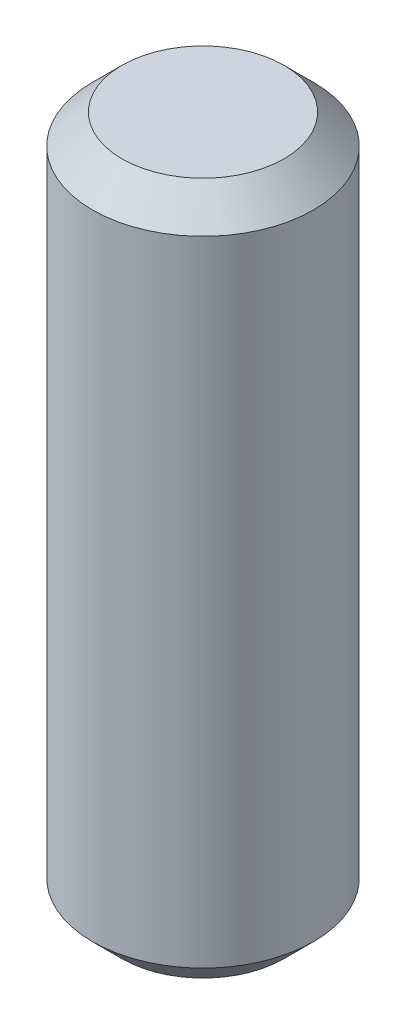
ISO-10303-21;
HEADER;
FILE_DESCRIPTION(('STEP AP214'),'2;1');
FILE_NAME('part.step','',(''),(''),'','','');
FILE_SCHEMA(('AUTOMOTIVE_DESIGN { 1 0 10303 214 1 1 1 1 }'));
ENDSEC;
DATA;
#1=APPLICATION_CONTEXT('core data for automotive mechanical design processes');
#2=APPLICATION_PROTOCOL_DEFINITION('international standard','automotive_design',2000,#1);
#3=PRODUCT_CONTEXT('',#1,'mechanical');
#4=PRODUCT('Part','Part','',(#3));
#5=PRODUCT_RELATED_PRODUCT_CATEGORY('part','',(#4));
#6=PRODUCT_DEFINITION_FORMATION('','',#4);
#7=PRODUCT_DEFINITION_CONTEXT('part definition',#1,'design');
#8=PRODUCT_DEFINITION('design','',#6,#7);
#9=PRODUCT_DEFINITION_SHAPE('','',#8);
#10=(LENGTH_UNIT() NAMED_UNIT(*) SI_UNIT(.MILLI.,.METRE.));
#11=(NAMED_UNIT(*) PLANE_ANGLE_UNIT() SI_UNIT($,.RADIAN.));
#12=(NAMED_UNIT(*) SI_UNIT($,.STERADIAN.) SOLID_ANGLE_UNIT());
#13=UNCERTAINTY_MEASURE_WITH_UNIT(LENGTH_MEASURE(1.E-05),#10,'distance_accuracy_value','');
#14=(GEOMETRIC_REPRESENTATION_CONTEXT(3) GLOBAL_UNCERTAINTY_ASSIGNED_CONTEXT((#13)) GLOBAL_UNIT_ASSIGNED_CONTEXT((#10,
#11,#12)) REPRESENTATION_CONTEXT('',''));
#15=CARTESIAN_POINT('',(0.,0.,0.));
#16=DIRECTION('',(0.,0.,1.));
#17=DIRECTION('',(1.,0.,0.));
#18=AXIS2_PLACEMENT_3D('',#15,#16,#17);
#19=CARTESIAN_POINT('',(0.,4.7,0.));
#20=DIRECTION('',(0.,-1.,0.));
#21=DIRECTION('',(0.,0.,-1.));
#22=AXIS2_PLACEMENT_3D('',#19,#20,#21);
#23=CYLINDRICAL_SURFACE('',#22,0.75);
#24=CARTESIAN_POINT('',(0.,0.2,0.));
#25=DIRECTION('',(0.,1.,0.));
#26=DIRECTION('',(0.,0.,1.));
#27=AXIS2_PLACEMENT_3D('',#24,#25,#26);
#28=CIRCLE('',#27,0.75);
#29=CARTESIAN_POINT('',(0.,0.2,0.75));
#30=VERTEX_POINT('',#29);
#31=EDGE_CURVE('E59',#30,#30,#28,.T.);
#32=ORIENTED_EDGE('',*,*,#31,.T.);
#33=EDGE_LOOP('',(#32));
#34=FACE_BOUND('',#33,.T.);
#35=CARTESIAN_POINT('',(0.,4.5,0.));
#36=DIRECTION('',(0.,1.,0.));
#37=DIRECTION('',(0.,0.,1.));
#38=AXIS2_PLACEMENT_3D('',#35,#36,#37);
#39=CIRCLE('',#38,0.75);
#40=CARTESIAN_POINT('',(0.,4.5,0.75));
#41=VERTEX_POINT('',#40);
#42=EDGE_CURVE('E64',#41,#41,#39,.F.);
#43=ORIENTED_EDGE('',*,*,#42,.T.);
#44=EDGE_LOOP('',(#43));
#45=FACE_BOUND('',#44,.T.);
#46=ADVANCED_FACE('F45',(#34,#45),#23,.T.);
#47=CARTESIAN_POINT('',(0.,4.7,0.));
#48=DIRECTION('',(0.,1.,0.));
#49=DIRECTION('',(0.,0.,1.));
#50=AXIS2_PLACEMENT_3D('',#47,#48,#49);
#51=PLANE('',#50);
#52=CARTESIAN_POINT('',(0.,4.7,0.));
#53=DIRECTION('',(0.,1.,0.));
#54=DIRECTION('',(0.,0.,1.));
#55=AXIS2_PLACEMENT_3D('',#52,#53,#54);
#56=CIRCLE('',#55,0.55);
#57=CARTESIAN_POINT('',(0.,4.7,0.55));
#58=VERTEX_POINT('',#57);
#59=EDGE_CURVE('E10',#58,#58,#56,.T.);
#60=ORIENTED_EDGE('',*,*,#59,.T.);
#61=EDGE_LOOP('',(#60));
#62=FACE_BOUND('',#61,.T.);
#63=ADVANCED_FACE('F81',(#62),#51,.T.);
#64=CARTESIAN_POINT('',(0.,0.,0.));
#65=DIRECTION('',(0.,1.,0.));
#66=DIRECTION('',(0.,0.,1.));
#67=AXIS2_PLACEMENT_3D('',#64,#65,#66);
#68=PLANE('',#67);
#69=CARTESIAN_POINT('',(0.,0.,0.));
#70=DIRECTION('',(0.,1.,0.));
#71=DIRECTION('',(0.,0.,1.));
#72=AXIS2_PLACEMENT_3D('',#69,#70,#71);
#73=CIRCLE('',#72,0.55);
#74=CARTESIAN_POINT('',(0.,0.,0.55));
#75=VERTEX_POINT('',#74);
#76=EDGE_CURVE('E54',#75,#75,#73,.F.);
#77=ORIENTED_EDGE('',*,*,#76,.T.);
#78=EDGE_LOOP('',(#77));
#79=FACE_BOUND('',#78,.T.);
#80=ADVANCED_FACE('F78',(#79),#68,.F.);
#81=CARTESIAN_POINT('',(0.,0.2,0.));
#82=DIRECTION('',(0.,1.,0.));
#83=DIRECTION('',(0.,0.,1.));
#84=AXIS2_PLACEMENT_3D('',#81,#82,#83);
#85=CONICAL_SURFACE('',#84,0.75,0.785398163397449);
#86=ORIENTED_EDGE('',*,*,#76,.F.);
#87=EDGE_LOOP('',(#86));
#88=FACE_BOUND('',#87,.T.);
#89=ORIENTED_EDGE('',*,*,#31,.F.);
#90=EDGE_LOOP('',(#89));
#91=FACE_BOUND('',#90,.T.);
#92=ADVANCED_FACE('F74',(#88,#91),#85,.T.);
#93=CARTESIAN_POINT('',(0.,4.7,0.));
#94=DIRECTION('',(0.,-1.,0.));
#95=DIRECTION('',(0.,0.,-1.));
#96=AXIS2_PLACEMENT_3D('',#93,#94,#95);
#97=CONICAL_SURFACE('',#96,0.55,0.785398163397446);
#98=ORIENTED_EDGE('',*,*,#42,.F.);
#99=EDGE_LOOP('',(#98));
#100=FACE_BOUND('',#99,.T.);
#101=ORIENTED_EDGE('',*,*,#59,.F.);
#102=EDGE_LOOP('',(#101));
#103=FACE_BOUND('',#102,.T.);
#104=ADVANCED_FACE('F48',(#100,#103),#97,.T.);
#105=CLOSED_SHELL('',(#46,#63,#80,#92,#104));
#106=MANIFOLD_SOLID_BREP('B2',#105);
#107=ADVANCED_BREP_SHAPE_REPRESENTATION('',(#18,#106),#14);
#108=SHAPE_DEFINITION_REPRESENTATION(#9,#107);
ENDSEC;
END-ISO-10303-21;
